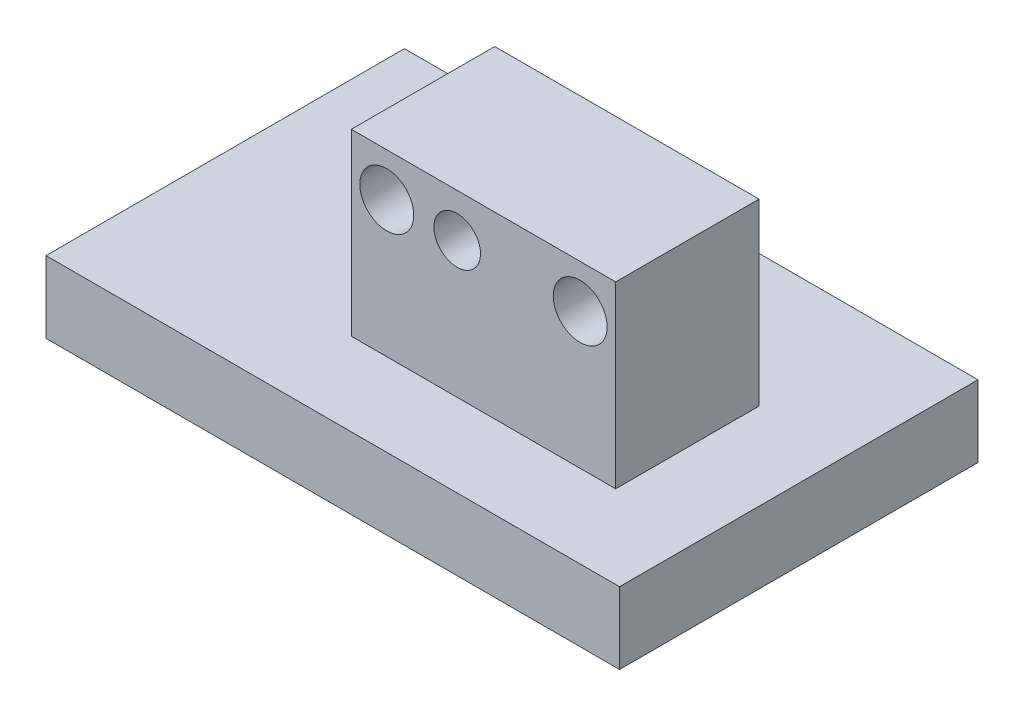
ISO-10303-21;
HEADER;
FILE_DESCRIPTION(('STEP AP214'),'2;1');
FILE_NAME('part.step','',(''),(''),'','','');
FILE_SCHEMA(('AUTOMOTIVE_DESIGN { 1 0 10303 214 1 1 1 1 }'));
ENDSEC;
DATA;
#1=APPLICATION_CONTEXT('core data for automotive mechanical design processes');
#2=APPLICATION_PROTOCOL_DEFINITION('international standard','automotive_design',2000,#1);
#3=PRODUCT_CONTEXT('',#1,'mechanical');
#4=PRODUCT('Part','Part','',(#3));
#5=PRODUCT_RELATED_PRODUCT_CATEGORY('part','',(#4));
#6=PRODUCT_DEFINITION_FORMATION('','',#4);
#7=PRODUCT_DEFINITION_CONTEXT('part definition',#1,'design');
#8=PRODUCT_DEFINITION('design','',#6,#7);
#9=PRODUCT_DEFINITION_SHAPE('','',#8);
#10=(LENGTH_UNIT() NAMED_UNIT(*) SI_UNIT(.MILLI.,.METRE.));
#11=(NAMED_UNIT(*) PLANE_ANGLE_UNIT() SI_UNIT($,.RADIAN.));
#12=(NAMED_UNIT(*) SI_UNIT($,.STERADIAN.) SOLID_ANGLE_UNIT());
#13=UNCERTAINTY_MEASURE_WITH_UNIT(LENGTH_MEASURE(1.E-05),#10,'distance_accuracy_value','');
#14=(GEOMETRIC_REPRESENTATION_CONTEXT(3) GLOBAL_UNCERTAINTY_ASSIGNED_CONTEXT((#13)) GLOBAL_UNIT_ASSIGNED_CONTEXT((#10,
#11,#12)) REPRESENTATION_CONTEXT('',''));
#15=CARTESIAN_POINT('',(0.,0.,0.));
#16=DIRECTION('',(0.,0.,1.));
#17=DIRECTION('',(1.,0.,0.));
#18=AXIS2_PLACEMENT_3D('',#15,#16,#17);
#19=CARTESIAN_POINT('',(0.,0.,0.));
#20=DIRECTION('',(0.,-1.,0.));
#21=DIRECTION('',(0.,0.,-1.));
#22=AXIS2_PLACEMENT_3D('',#19,#20,#21);
#23=PLANE('',#22);
#24=DIRECTION('',(0.,0.,-1.));
#25=VECTOR('',#24,1.);
#26=CARTESIAN_POINT('',(-40.,0.,25.));
#27=LINE('',#26,#25);
#28=CARTESIAN_POINT('',(-40.,0.,25.));
#29=VERTEX_POINT('',#28);
#30=CARTESIAN_POINT('',(-40.,0.,-25.));
#31=VERTEX_POINT('',#30);
#32=EDGE_CURVE('E135',#29,#31,#27,.T.);
#33=ORIENTED_EDGE('',*,*,#32,.F.);
#34=DIRECTION('',(1.,0.,0.));
#35=VECTOR('',#34,1.);
#36=CARTESIAN_POINT('',(-40.,0.,25.));
#37=LINE('',#36,#35);
#38=CARTESIAN_POINT('',(40.,0.,25.));
#39=VERTEX_POINT('',#38);
#40=EDGE_CURVE('E151',#29,#39,#37,.T.);
#41=ORIENTED_EDGE('',*,*,#40,.T.);
#42=DIRECTION('',(0.,0.,-1.));
#43=VECTOR('',#42,1.);
#44=CARTESIAN_POINT('',(40.,0.,25.));
#45=LINE('',#44,#43);
#46=CARTESIAN_POINT('',(40.,0.,-25.));
#47=VERTEX_POINT('',#46);
#48=EDGE_CURVE('E166',#39,#47,#45,.T.);
#49=ORIENTED_EDGE('',*,*,#48,.T.);
#50=DIRECTION('',(1.,0.,0.));
#51=VECTOR('',#50,1.);
#52=CARTESIAN_POINT('',(-40.,0.,-25.));
#53=LINE('',#52,#51);
#54=EDGE_CURVE('E140',#31,#47,#53,.T.);
#55=ORIENTED_EDGE('',*,*,#54,.F.);
#56=EDGE_LOOP('',(#33,#41,#49,#55));
#57=FACE_BOUND('',#56,.T.);
#58=DIRECTION('',(1.,0.,0.));
#59=VECTOR('',#58,1.);
#60=CARTESIAN_POINT('',(0.,0.,13.4476534296029));
#61=LINE('',#60,#59);
#62=CARTESIAN_POINT('',(-8.96548529377797,0.,13.4476534296029));
#63=VERTEX_POINT('',#62);
#64=CARTESIAN_POINT('',(27.9061371841155,0.,13.4476534296029));
#65=VERTEX_POINT('',#64);
#66=EDGE_CURVE('E61',#63,#65,#61,.T.);
#67=ORIENTED_EDGE('',*,*,#66,.F.);
#68=DIRECTION('',(0.,0.,-1.));
#69=VECTOR('',#68,1.);
#70=CARTESIAN_POINT('',(-8.96548529377797,0.,0.));
#71=LINE('',#70,#69);
#72=CARTESIAN_POINT('',(-8.96548529377797,0.,-6.55234657039712));
#73=VERTEX_POINT('',#72);
#74=EDGE_CURVE('E66',#63,#73,#71,.T.);
#75=ORIENTED_EDGE('',*,*,#74,.T.);
#76=DIRECTION('',(1.,0.,0.));
#77=VECTOR('',#76,1.);
#78=CARTESIAN_POINT('',(0.,0.,-6.55234657039712));
#79=LINE('',#78,#77);
#80=CARTESIAN_POINT('',(27.9061371841155,0.,-6.55234657039712));
#81=VERTEX_POINT('',#80);
#82=EDGE_CURVE('E345',#73,#81,#79,.T.);
#83=ORIENTED_EDGE('',*,*,#82,.T.);
#84=DIRECTION('',(0.,0.,-1.));
#85=VECTOR('',#84,1.);
#86=CARTESIAN_POINT('',(27.9061371841155,0.,0.));
#87=LINE('',#86,#85);
#88=EDGE_CURVE('E318',#65,#81,#87,.T.);
#89=ORIENTED_EDGE('',*,*,#88,.F.);
#90=EDGE_LOOP('',(#67,#75,#83,#89));
#91=FACE_BOUND('',#90,.T.);
#92=ADVANCED_FACE('F45',(#57,#91),#23,.F.);
#93=CARTESIAN_POINT('',(-40.,-10.,25.));
#94=DIRECTION('',(1.,0.,0.));
#95=DIRECTION('',(0.,0.,-1.));
#96=AXIS2_PLACEMENT_3D('',#93,#94,#95);
#97=PLANE('',#96);
#98=ORIENTED_EDGE('',*,*,#32,.T.);
#99=DIRECTION('',(0.,1.,0.));
#100=VECTOR('',#99,1.);
#101=CARTESIAN_POINT('',(-40.,-10.,-25.));
#102=LINE('',#101,#100);
#103=CARTESIAN_POINT('',(-40.,-10.,-25.));
#104=VERTEX_POINT('',#103);
#105=EDGE_CURVE('E11',#104,#31,#102,.T.);
#106=ORIENTED_EDGE('',*,*,#105,.F.);
#107=DIRECTION('',(0.,0.,-1.));
#108=VECTOR('',#107,1.);
#109=CARTESIAN_POINT('',(-40.,-10.,25.));
#110=LINE('',#109,#108);
#111=CARTESIAN_POINT('',(-40.,-10.,25.));
#112=VERTEX_POINT('',#111);
#113=EDGE_CURVE('E146',#112,#104,#110,.T.);
#114=ORIENTED_EDGE('',*,*,#113,.F.);
#115=DIRECTION('',(0.,1.,0.));
#116=VECTOR('',#115,1.);
#117=CARTESIAN_POINT('',(-40.,-10.,25.));
#118=LINE('',#117,#116);
#119=EDGE_CURVE('E161',#112,#29,#118,.T.);
#120=ORIENTED_EDGE('',*,*,#119,.T.);
#121=EDGE_LOOP('',(#98,#106,#114,#120));
#122=FACE_BOUND('',#121,.T.);
#123=ADVANCED_FACE('F47',(#122),#97,.F.);
#124=CARTESIAN_POINT('',(-40.,-10.,-25.));
#125=DIRECTION('',(0.,0.,1.));
#126=DIRECTION('',(1.,0.,0.));
#127=AXIS2_PLACEMENT_3D('',#124,#125,#126);
#128=PLANE('',#127);
#129=ORIENTED_EDGE('',*,*,#54,.T.);
#130=DIRECTION('',(0.,1.,0.));
#131=VECTOR('',#130,1.);
#132=CARTESIAN_POINT('',(40.,-10.,-25.));
#133=LINE('',#132,#131);
#134=CARTESIAN_POINT('',(40.,-10.,-25.));
#135=VERTEX_POINT('',#134);
#136=EDGE_CURVE('E54',#135,#47,#133,.T.);
#137=ORIENTED_EDGE('',*,*,#136,.F.);
#138=DIRECTION('',(1.,0.,0.));
#139=VECTOR('',#138,1.);
#140=CARTESIAN_POINT('',(-40.,-10.,-25.));
#141=LINE('',#140,#139);
#142=EDGE_CURVE('E150',#104,#135,#141,.T.);
#143=ORIENTED_EDGE('',*,*,#142,.F.);
#144=ORIENTED_EDGE('',*,*,#105,.T.);
#145=EDGE_LOOP('',(#129,#137,#143,#144));
#146=FACE_BOUND('',#145,.T.);
#147=ADVANCED_FACE('F184',(#146),#128,.F.);
#148=CARTESIAN_POINT('',(40.,-10.,25.));
#149=DIRECTION('',(1.,0.,0.));
#150=DIRECTION('',(0.,0.,-1.));
#151=AXIS2_PLACEMENT_3D('',#148,#149,#150);
#152=PLANE('',#151);
#153=ORIENTED_EDGE('',*,*,#48,.F.);
#154=DIRECTION('',(0.,1.,0.));
#155=VECTOR('',#154,1.);
#156=CARTESIAN_POINT('',(40.,-10.,25.));
#157=LINE('',#156,#155);
#158=CARTESIAN_POINT('',(40.,-10.,25.));
#159=VERTEX_POINT('',#158);
#160=EDGE_CURVE('E175',#159,#39,#157,.T.);
#161=ORIENTED_EDGE('',*,*,#160,.F.);
#162=DIRECTION('',(0.,0.,-1.));
#163=VECTOR('',#162,1.);
#164=CARTESIAN_POINT('',(40.,-10.,25.));
#165=LINE('',#164,#163);
#166=EDGE_CURVE('E154',#159,#135,#165,.T.);
#167=ORIENTED_EDGE('',*,*,#166,.T.);
#168=ORIENTED_EDGE('',*,*,#136,.T.);
#169=EDGE_LOOP('',(#153,#161,#167,#168));
#170=FACE_BOUND('',#169,.T.);
#171=ADVANCED_FACE('F181',(#170),#152,.T.);
#172=CARTESIAN_POINT('',(-40.,-10.,25.));
#173=DIRECTION('',(0.,0.,1.));
#174=DIRECTION('',(1.,0.,0.));
#175=AXIS2_PLACEMENT_3D('',#172,#173,#174);
#176=PLANE('',#175);
#177=ORIENTED_EDGE('',*,*,#40,.F.);
#178=ORIENTED_EDGE('',*,*,#119,.F.);
#179=DIRECTION('',(1.,0.,0.));
#180=VECTOR('',#179,1.);
#181=CARTESIAN_POINT('',(-40.,-10.,25.));
#182=LINE('',#181,#180);
#183=EDGE_CURVE('E158',#112,#159,#182,.T.);
#184=ORIENTED_EDGE('',*,*,#183,.T.);
#185=ORIENTED_EDGE('',*,*,#160,.T.);
#186=EDGE_LOOP('',(#177,#178,#184,#185));
#187=FACE_BOUND('',#186,.T.);
#188=ADVANCED_FACE('F190',(#187),#176,.T.);
#189=CARTESIAN_POINT('',(0.,-10.,0.));
#190=DIRECTION('',(0.,-1.,0.));
#191=DIRECTION('',(0.,0.,-1.));
#192=AXIS2_PLACEMENT_3D('',#189,#190,#191);
#193=PLANE('',#192);
#194=ORIENTED_EDGE('',*,*,#113,.T.);
#195=ORIENTED_EDGE('',*,*,#142,.T.);
#196=ORIENTED_EDGE('',*,*,#166,.F.);
#197=ORIENTED_EDGE('',*,*,#183,.F.);
#198=EDGE_LOOP('',(#194,#195,#196,#197));
#199=FACE_BOUND('',#198,.T.);
#200=ADVANCED_FACE('F194',(#199),#193,.T.);
#201=CARTESIAN_POINT('',(0.,25.,13.4476534296029));
#202=DIRECTION('',(0.,0.,-1.));
#203=DIRECTION('',(-1.,0.,0.));
#204=AXIS2_PLACEMENT_3D('',#201,#202,#203);
#205=PLANE('',#204);
#206=CARTESIAN_POINT('',(-4.01828634214295,18.9612485440669,13.4476534296029));
#207=DIRECTION('',(0.,0.,1.));
#208=DIRECTION('',(1.,0.,0.));
#209=AXIS2_PLACEMENT_3D('',#206,#207,#208);
#210=CIRCLE('',#209,3.76098090720758);
#211=CARTESIAN_POINT('',(-0.257305434935371,18.9612485440669,13.4476534296029));
#212=VERTEX_POINT('',#211);
#213=EDGE_CURVE('E310',#212,#212,#210,.T.);
#214=ORIENTED_EDGE('',*,*,#213,.F.);
#215=EDGE_LOOP('',(#214));
#216=FACE_BOUND('',#215,.T.);
#217=CARTESIAN_POINT('',(22.9589382324805,18.9612485440669,13.4476534296029));
#218=DIRECTION('',(0.,0.,1.));
#219=DIRECTION('',(-1.,0.,0.));
#220=AXIS2_PLACEMENT_3D('',#217,#218,#219);
#221=CIRCLE('',#220,3.76098090720758);
#222=CARTESIAN_POINT('',(19.1979573252729,18.9612485440669,13.4476534296029));
#223=VERTEX_POINT('',#222);
#224=EDGE_CURVE('E320',#223,#223,#221,.T.);
#225=ORIENTED_EDGE('',*,*,#224,.F.);
#226=EDGE_LOOP('',(#225));
#227=FACE_BOUND('',#226,.T.);
#228=CARTESIAN_POINT('',(5.79860132984444,18.9612485440669,13.4476534296029));
#229=DIRECTION('',(0.,0.,1.));
#230=DIRECTION('',(1.,0.,0.));
#231=AXIS2_PLACEMENT_3D('',#228,#229,#230);
#232=CIRCLE('',#231,3.25);
#233=CARTESIAN_POINT('',(9.04860132984444,18.9612485440669,13.4476534296029));
#234=VERTEX_POINT('',#233);
#235=EDGE_CURVE('E327',#234,#234,#232,.T.);
#236=ORIENTED_EDGE('',*,*,#235,.F.);
#237=EDGE_LOOP('',(#236));
#238=FACE_BOUND('',#237,.T.);
#239=ORIENTED_EDGE('',*,*,#66,.T.);
#240=DIRECTION('',(0.,-1.,0.));
#241=VECTOR('',#240,1.);
#242=CARTESIAN_POINT('',(27.9061371841155,25.,13.4476534296029));
#243=LINE('',#242,#241);
#244=CARTESIAN_POINT('',(27.9061371841155,25.,13.4476534296029));
#245=VERTEX_POINT('',#244);
#246=EDGE_CURVE('E115',#245,#65,#243,.T.);
#247=ORIENTED_EDGE('',*,*,#246,.F.);
#248=DIRECTION('',(1.,0.,0.));
#249=VECTOR('',#248,1.);
#250=CARTESIAN_POINT('',(0.,25.,13.4476534296029));
#251=LINE('',#250,#249);
#252=CARTESIAN_POINT('',(-8.96548529377797,25.,13.4476534296029));
#253=VERTEX_POINT('',#252);
#254=EDGE_CURVE('E123',#253,#245,#251,.T.);
#255=ORIENTED_EDGE('',*,*,#254,.F.);
#256=DIRECTION('',(0.,-1.,0.));
#257=VECTOR('',#256,1.);
#258=CARTESIAN_POINT('',(-8.96548529377797,25.,13.4476534296029));
#259=LINE('',#258,#257);
#260=EDGE_CURVE('E341',#253,#63,#259,.T.);
#261=ORIENTED_EDGE('',*,*,#260,.T.);
#262=EDGE_LOOP('',(#239,#247,#255,#261));
#263=FACE_BOUND('',#262,.T.);
#264=ADVANCED_FACE('F133',(#216,#227,#238,#263),#205,.F.);
#265=CARTESIAN_POINT('',(27.9061371841155,25.,0.));
#266=DIRECTION('',(-1.,0.,0.));
#267=DIRECTION('',(0.,0.,1.));
#268=AXIS2_PLACEMENT_3D('',#265,#266,#267);
#269=PLANE('',#268);
#270=ORIENTED_EDGE('',*,*,#88,.T.);
#271=DIRECTION('',(0.,-1.,0.));
#272=VECTOR('',#271,1.);
#273=CARTESIAN_POINT('',(27.9061371841155,25.,-6.55234657039712));
#274=LINE('',#273,#272);
#275=CARTESIAN_POINT('',(27.9061371841155,25.,-6.55234657039712));
#276=VERTEX_POINT('',#275);
#277=EDGE_CURVE('E117',#276,#81,#274,.T.);
#278=ORIENTED_EDGE('',*,*,#277,.F.);
#279=DIRECTION('',(0.,0.,-1.));
#280=VECTOR('',#279,1.);
#281=CARTESIAN_POINT('',(27.9061371841155,25.,0.));
#282=LINE('',#281,#280);
#283=EDGE_CURVE('E110',#245,#276,#282,.T.);
#284=ORIENTED_EDGE('',*,*,#283,.F.);
#285=ORIENTED_EDGE('',*,*,#246,.T.);
#286=EDGE_LOOP('',(#270,#278,#284,#285));
#287=FACE_BOUND('',#286,.T.);
#288=ADVANCED_FACE('F113',(#287),#269,.F.);
#289=CARTESIAN_POINT('',(0.,25.,-6.55234657039712));
#290=DIRECTION('',(0.,0.,-1.));
#291=DIRECTION('',(-1.,0.,0.));
#292=AXIS2_PLACEMENT_3D('',#289,#290,#291);
#293=PLANE('',#292);
#294=CARTESIAN_POINT('',(-4.01828634214295,18.9612485440669,-6.55234657039712));
#295=DIRECTION('',(0.,0.,-1.));
#296=DIRECTION('',(-1.,0.,0.));
#297=AXIS2_PLACEMENT_3D('',#294,#295,#296);
#298=CIRCLE('',#297,3.76098090720758);
#299=CARTESIAN_POINT('',(-7.77926724935053,18.9612485440669,-6.55234657039712));
#300=VERTEX_POINT('',#299);
#301=EDGE_CURVE('E313',#300,#300,#298,.F.);
#302=ORIENTED_EDGE('',*,*,#301,.T.);
#303=EDGE_LOOP('',(#302));
#304=FACE_BOUND('',#303,.T.);
#305=CARTESIAN_POINT('',(22.9589382324805,18.9612485440669,-6.55234657039712));
#306=DIRECTION('',(0.,0.,-1.));
#307=DIRECTION('',(-1.,0.,0.));
#308=AXIS2_PLACEMENT_3D('',#305,#306,#307);
#309=CIRCLE('',#308,3.76098090720758);
#310=CARTESIAN_POINT('',(19.1979573252729,18.9612485440669,-6.55234657039712));
#311=VERTEX_POINT('',#310);
#312=EDGE_CURVE('E323',#311,#311,#309,.F.);
#313=ORIENTED_EDGE('',*,*,#312,.T.);
#314=EDGE_LOOP('',(#313));
#315=FACE_BOUND('',#314,.T.);
#316=CARTESIAN_POINT('',(5.79860132984444,18.9612485440669,-6.55234657039712));
#317=DIRECTION('',(0.,0.,-1.));
#318=DIRECTION('',(-1.,0.,0.));
#319=AXIS2_PLACEMENT_3D('',#316,#317,#318);
#320=CIRCLE('',#319,3.25);
#321=CARTESIAN_POINT('',(2.54860132984445,18.9612485440669,-6.55234657039712));
#322=VERTEX_POINT('',#321);
#323=EDGE_CURVE('E331',#322,#322,#320,.F.);
#324=ORIENTED_EDGE('',*,*,#323,.T.);
#325=EDGE_LOOP('',(#324));
#326=FACE_BOUND('',#325,.T.);
#327=ORIENTED_EDGE('',*,*,#82,.F.);
#328=DIRECTION('',(0.,-1.,0.));
#329=VECTOR('',#328,1.);
#330=CARTESIAN_POINT('',(-8.96548529377797,25.,-6.55234657039712));
#331=LINE('',#330,#329);
#332=CARTESIAN_POINT('',(-8.96548529377797,25.,-6.55234657039712));
#333=VERTEX_POINT('',#332);
#334=EDGE_CURVE('E142',#333,#73,#331,.T.);
#335=ORIENTED_EDGE('',*,*,#334,.F.);
#336=DIRECTION('',(1.,0.,0.));
#337=VECTOR('',#336,1.);
#338=CARTESIAN_POINT('',(0.,25.,-6.55234657039712));
#339=LINE('',#338,#337);
#340=EDGE_CURVE('E122',#333,#276,#339,.T.);
#341=ORIENTED_EDGE('',*,*,#340,.T.);
#342=ORIENTED_EDGE('',*,*,#277,.T.);
#343=EDGE_LOOP('',(#327,#335,#341,#342));
#344=FACE_BOUND('',#343,.T.);
#345=ADVANCED_FACE('F249',(#304,#315,#326,#344),#293,.T.);
#346=CARTESIAN_POINT('',(-8.96548529377797,25.,0.));
#347=DIRECTION('',(-1.,0.,0.));
#348=DIRECTION('',(0.,0.,1.));
#349=AXIS2_PLACEMENT_3D('',#346,#347,#348);
#350=PLANE('',#349);
#351=ORIENTED_EDGE('',*,*,#74,.F.);
#352=ORIENTED_EDGE('',*,*,#260,.F.);
#353=DIRECTION('',(0.,0.,-1.));
#354=VECTOR('',#353,1.);
#355=CARTESIAN_POINT('',(-8.96548529377797,25.,0.));
#356=LINE('',#355,#354);
#357=EDGE_CURVE('E129',#253,#333,#356,.T.);
#358=ORIENTED_EDGE('',*,*,#357,.T.);
#359=ORIENTED_EDGE('',*,*,#334,.T.);
#360=EDGE_LOOP('',(#351,#352,#358,#359));
#361=FACE_BOUND('',#360,.T.);
#362=ADVANCED_FACE('F258',(#361),#350,.T.);
#363=CARTESIAN_POINT('',(0.,25.,0.));
#364=DIRECTION('',(0.,1.,0.));
#365=DIRECTION('',(0.,0.,1.));
#366=AXIS2_PLACEMENT_3D('',#363,#364,#365);
#367=PLANE('',#366);
#368=ORIENTED_EDGE('',*,*,#254,.T.);
#369=ORIENTED_EDGE('',*,*,#283,.T.);
#370=ORIENTED_EDGE('',*,*,#340,.F.);
#371=ORIENTED_EDGE('',*,*,#357,.F.);
#372=EDGE_LOOP('',(#368,#369,#370,#371));
#373=FACE_BOUND('',#372,.T.);
#374=ADVANCED_FACE('F127',(#373),#367,.T.);
#375=CARTESIAN_POINT('',(5.79860132984444,18.9612485440669,-17.1900069839956));
#376=DIRECTION('',(0.,0.,1.));
#377=DIRECTION('',(1.,0.,0.));
#378=AXIS2_PLACEMENT_3D('',#375,#376,#377);
#379=CYLINDRICAL_SURFACE('',#378,3.25);
#380=ORIENTED_EDGE('',*,*,#235,.T.);
#381=EDGE_LOOP('',(#380));
#382=FACE_BOUND('',#381,.T.);
#383=ORIENTED_EDGE('',*,*,#323,.F.);
#384=EDGE_LOOP('',(#383));
#385=FACE_BOUND('',#384,.T.);
#386=ADVANCED_FACE('F276',(#382,#385),#379,.F.);
#387=CARTESIAN_POINT('',(22.9589382324805,18.9612485440669,-17.1900069839956));
#388=DIRECTION('',(0.,0.,1.));
#389=DIRECTION('',(1.,0.,0.));
#390=AXIS2_PLACEMENT_3D('',#387,#388,#389);
#391=CYLINDRICAL_SURFACE('',#390,3.76098090720758);
#392=ORIENTED_EDGE('',*,*,#224,.T.);
#393=EDGE_LOOP('',(#392));
#394=FACE_BOUND('',#393,.T.);
#395=ORIENTED_EDGE('',*,*,#312,.F.);
#396=EDGE_LOOP('',(#395));
#397=FACE_BOUND('',#396,.T.);
#398=ADVANCED_FACE('F284',(#394,#397),#391,.F.);
#399=CARTESIAN_POINT('',(-4.01828634214295,18.9612485440669,-17.1900069839956));
#400=DIRECTION('',(0.,0.,1.));
#401=DIRECTION('',(1.,0.,0.));
#402=AXIS2_PLACEMENT_3D('',#399,#400,#401);
#403=CYLINDRICAL_SURFACE('',#402,3.76098090720758);
#404=ORIENTED_EDGE('',*,*,#213,.T.);
#405=EDGE_LOOP('',(#404));
#406=FACE_BOUND('',#405,.T.);
#407=ORIENTED_EDGE('',*,*,#301,.F.);
#408=EDGE_LOOP('',(#407));
#409=FACE_BOUND('',#408,.T.);
#410=ADVANCED_FACE('F294',(#406,#409),#403,.F.);
#411=CLOSED_SHELL('',(#92,#123,#147,#171,#188,#200,#264,#288,#345,#362,#374,#386,#398,#410));
#412=MANIFOLD_SOLID_BREP('B2',#411);
#413=ADVANCED_BREP_SHAPE_REPRESENTATION('',(#18,#412),#14);
#414=SHAPE_DEFINITION_REPRESENTATION(#9,#413);
ENDSEC;
END-ISO-10303-21;
